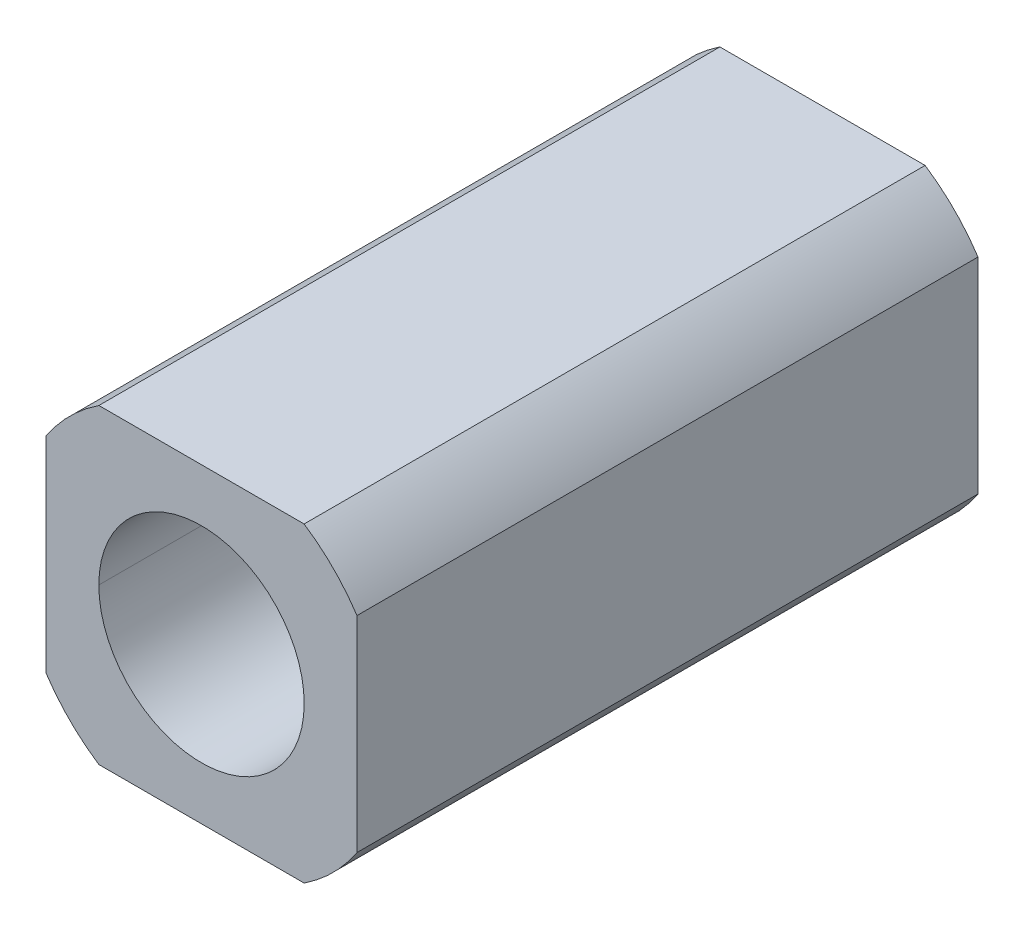
ISO-10303-21;
HEADER;
FILE_DESCRIPTION(('STEP AP214'),'2;1');
FILE_NAME('part.step','',(''),(''),'','','');
FILE_SCHEMA(('AUTOMOTIVE_DESIGN { 1 0 10303 214 1 1 1 1 }'));
ENDSEC;
DATA;
#1=APPLICATION_CONTEXT('core data for automotive mechanical design processes');
#2=APPLICATION_PROTOCOL_DEFINITION('international standard','automotive_design',2000,#1);
#3=PRODUCT_CONTEXT('',#1,'mechanical');
#4=PRODUCT('Part','Part','',(#3));
#5=PRODUCT_RELATED_PRODUCT_CATEGORY('part','',(#4));
#6=PRODUCT_DEFINITION_FORMATION('','',#4);
#7=PRODUCT_DEFINITION_CONTEXT('part definition',#1,'design');
#8=PRODUCT_DEFINITION('design','',#6,#7);
#9=PRODUCT_DEFINITION_SHAPE('','',#8);
#10=(LENGTH_UNIT() NAMED_UNIT(*) SI_UNIT(.MILLI.,.METRE.));
#11=(NAMED_UNIT(*) PLANE_ANGLE_UNIT() SI_UNIT($,.RADIAN.));
#12=(NAMED_UNIT(*) SI_UNIT($,.STERADIAN.) SOLID_ANGLE_UNIT());
#13=UNCERTAINTY_MEASURE_WITH_UNIT(LENGTH_MEASURE(1.E-05),#10,'distance_accuracy_value','');
#14=(GEOMETRIC_REPRESENTATION_CONTEXT(3) GLOBAL_UNCERTAINTY_ASSIGNED_CONTEXT((#13)) GLOBAL_UNIT_ASSIGNED_CONTEXT((#10,
#11,#12)) REPRESENTATION_CONTEXT('',''));
#15=CARTESIAN_POINT('',(0.,0.,0.));
#16=DIRECTION('',(0.,0.,1.));
#17=DIRECTION('',(1.,0.,0.));
#18=AXIS2_PLACEMENT_3D('',#15,#16,#17);
#19=CARTESIAN_POINT('',(0.,0.,6.35));
#20=DIRECTION('',(0.,0.,-1.));
#21=DIRECTION('',(-1.,0.,0.));
#22=AXIS2_PLACEMENT_3D('',#19,#20,#21);
#23=CYLINDRICAL_SURFACE('',#22,2.1);
#24=DIRECTION('',(0.,0.,-1.));
#25=VECTOR('',#24,1.);
#26=CARTESIAN_POINT('',(2.1,0.,6.35));
#27=LINE('',#26,#25);
#28=CARTESIAN_POINT('',(2.1,0.,6.35));
#29=VERTEX_POINT('',#28);
#30=CARTESIAN_POINT('',(2.1,0.,-6.35));
#31=VERTEX_POINT('',#30);
#32=EDGE_CURVE('E153',#29,#31,#27,.T.);
#33=ORIENTED_EDGE('',*,*,#32,.F.);
#34=CARTESIAN_POINT('',(0.,0.,6.35));
#35=DIRECTION('',(0.,0.,1.));
#36=DIRECTION('',(1.,0.,0.));
#37=AXIS2_PLACEMENT_3D('',#34,#35,#36);
#38=CIRCLE('',#37,2.1);
#39=CARTESIAN_POINT('',(-2.1,0.,6.35));
#40=VERTEX_POINT('',#39);
#41=EDGE_CURVE('E231',#29,#40,#38,.T.);
#42=ORIENTED_EDGE('',*,*,#41,.T.);
#43=DIRECTION('',(0.,0.,-1.));
#44=VECTOR('',#43,1.);
#45=CARTESIAN_POINT('',(-2.1,0.,6.35));
#46=LINE('',#45,#44);
#47=CARTESIAN_POINT('',(-2.1,0.,-6.35));
#48=VERTEX_POINT('',#47);
#49=EDGE_CURVE('E156',#40,#48,#46,.T.);
#50=ORIENTED_EDGE('',*,*,#49,.T.);
#51=CARTESIAN_POINT('',(0.,0.,-6.35));
#52=DIRECTION('',(0.,0.,1.));
#53=DIRECTION('',(1.,0.,0.));
#54=AXIS2_PLACEMENT_3D('',#51,#52,#53);
#55=CIRCLE('',#54,2.1);
#56=EDGE_CURVE('E145',#31,#48,#55,.T.);
#57=ORIENTED_EDGE('',*,*,#56,.F.);
#58=EDGE_LOOP('',(#33,#42,#50,#57));
#59=FACE_BOUND('',#58,.T.);
#60=ADVANCED_FACE('F17',(#59),#23,.F.);
#61=CARTESIAN_POINT('',(3.18,-2.09849946390272,6.35));
#62=DIRECTION('',(-1.,0.,0.));
#63=DIRECTION('',(0.,0.,1.));
#64=AXIS2_PLACEMENT_3D('',#61,#62,#63);
#65=PLANE('',#64);
#66=DIRECTION('',(0.,1.,0.));
#67=VECTOR('',#66,1.);
#68=CARTESIAN_POINT('',(3.18,-2.09849946390272,-6.35));
#69=LINE('',#68,#67);
#70=CARTESIAN_POINT('',(3.18,-2.09849946390272,-6.35));
#71=VERTEX_POINT('',#70);
#72=CARTESIAN_POINT('',(3.18,2.09849946390272,-6.35));
#73=VERTEX_POINT('',#72);
#74=EDGE_CURVE('E240',#71,#73,#69,.T.);
#75=ORIENTED_EDGE('',*,*,#74,.T.);
#76=DIRECTION('',(0.,0.,-1.));
#77=VECTOR('',#76,1.);
#78=CARTESIAN_POINT('',(3.18,2.09849946390272,6.35));
#79=LINE('',#78,#77);
#80=CARTESIAN_POINT('',(3.18,2.09849946390272,6.35));
#81=VERTEX_POINT('',#80);
#82=EDGE_CURVE('E135',#81,#73,#79,.T.);
#83=ORIENTED_EDGE('',*,*,#82,.F.);
#84=DIRECTION('',(0.,1.,0.));
#85=VECTOR('',#84,1.);
#86=CARTESIAN_POINT('',(3.18,-2.09849946390272,6.35));
#87=LINE('',#86,#85);
#88=CARTESIAN_POINT('',(3.18,-2.09849946390272,6.35));
#89=VERTEX_POINT('',#88);
#90=EDGE_CURVE('E219',#89,#81,#87,.T.);
#91=ORIENTED_EDGE('',*,*,#90,.F.);
#92=DIRECTION('',(0.,0.,-1.));
#93=VECTOR('',#92,1.);
#94=CARTESIAN_POINT('',(3.18,-2.09849946390272,6.35));
#95=LINE('',#94,#93);
#96=EDGE_CURVE('E11',#89,#71,#95,.T.);
#97=ORIENTED_EDGE('',*,*,#96,.T.);
#98=EDGE_LOOP('',(#75,#83,#91,#97));
#99=FACE_BOUND('',#98,.T.);
#100=ADVANCED_FACE('F286',(#99),#65,.F.);
#101=CARTESIAN_POINT('',(0.,0.,6.35));
#102=DIRECTION('',(0.,0.,-1.));
#103=DIRECTION('',(-1.,0.,0.));
#104=AXIS2_PLACEMENT_3D('',#101,#102,#103);
#105=CYLINDRICAL_SURFACE('',#104,3.81);
#106=CARTESIAN_POINT('',(0.,0.,-6.35));
#107=DIRECTION('',(0.,0.,1.));
#108=DIRECTION('',(1.,0.,0.));
#109=AXIS2_PLACEMENT_3D('',#106,#107,#108);
#110=CIRCLE('',#109,3.81);
#111=CARTESIAN_POINT('',(2.09849946390272,-3.18,-6.35));
#112=VERTEX_POINT('',#111);
#113=EDGE_CURVE('E206',#112,#71,#110,.T.);
#114=ORIENTED_EDGE('',*,*,#113,.T.);
#115=ORIENTED_EDGE('',*,*,#96,.F.);
#116=CARTESIAN_POINT('',(0.,0.,6.35));
#117=DIRECTION('',(0.,0.,1.));
#118=DIRECTION('',(1.,0.,0.));
#119=AXIS2_PLACEMENT_3D('',#116,#117,#118);
#120=CIRCLE('',#119,3.81);
#121=CARTESIAN_POINT('',(2.09849946390272,-3.18,6.35));
#122=VERTEX_POINT('',#121);
#123=EDGE_CURVE('E215',#122,#89,#120,.T.);
#124=ORIENTED_EDGE('',*,*,#123,.F.);
#125=DIRECTION('',(0.,0.,-1.));
#126=VECTOR('',#125,1.);
#127=CARTESIAN_POINT('',(2.09849946390272,-3.18,6.35));
#128=LINE('',#127,#126);
#129=EDGE_CURVE('E28',#122,#112,#128,.T.);
#130=ORIENTED_EDGE('',*,*,#129,.T.);
#131=EDGE_LOOP('',(#114,#115,#124,#130));
#132=FACE_BOUND('',#131,.T.);
#133=ADVANCED_FACE('F291',(#132),#105,.T.);
#134=CARTESIAN_POINT('',(2.09849946390272,-3.18,6.35));
#135=DIRECTION('',(0.,1.,0.));
#136=DIRECTION('',(1.,0.,0.));
#137=AXIS2_PLACEMENT_3D('',#134,#135,#136);
#138=PLANE('',#137);
#139=DIRECTION('',(1.,0.,0.));
#140=VECTOR('',#139,1.);
#141=CARTESIAN_POINT('',(2.09849946390272,-3.18,-6.35));
#142=LINE('',#141,#140);
#143=CARTESIAN_POINT('',(-2.09849946390272,-3.18,-6.35));
#144=VERTEX_POINT('',#143);
#145=EDGE_CURVE('E185',#144,#112,#142,.T.);
#146=ORIENTED_EDGE('',*,*,#145,.T.);
#147=ORIENTED_EDGE('',*,*,#129,.F.);
#148=DIRECTION('',(1.,0.,0.));
#149=VECTOR('',#148,1.);
#150=CARTESIAN_POINT('',(2.09849946390272,-3.18,6.35));
#151=LINE('',#150,#149);
#152=CARTESIAN_POINT('',(-2.09849946390272,-3.18,6.35));
#153=VERTEX_POINT('',#152);
#154=EDGE_CURVE('E220',#153,#122,#151,.T.);
#155=ORIENTED_EDGE('',*,*,#154,.F.);
#156=DIRECTION('',(0.,0.,-1.));
#157=VECTOR('',#156,1.);
#158=CARTESIAN_POINT('',(-2.09849946390272,-3.18,6.35));
#159=LINE('',#158,#157);
#160=EDGE_CURVE('E85',#153,#144,#159,.T.);
#161=ORIENTED_EDGE('',*,*,#160,.T.);
#162=EDGE_LOOP('',(#146,#147,#155,#161));
#163=FACE_BOUND('',#162,.T.);
#164=ADVANCED_FACE('F19',(#163),#138,.F.);
#165=CARTESIAN_POINT('',(0.,0.,6.35));
#166=DIRECTION('',(0.,0.,-1.));
#167=DIRECTION('',(-1.,0.,0.));
#168=AXIS2_PLACEMENT_3D('',#165,#166,#167);
#169=CYLINDRICAL_SURFACE('',#168,3.81);
#170=CARTESIAN_POINT('',(0.,0.,-6.35));
#171=DIRECTION('',(0.,0.,1.));
#172=DIRECTION('',(1.,0.,0.));
#173=AXIS2_PLACEMENT_3D('',#170,#171,#172);
#174=CIRCLE('',#173,3.81);
#175=CARTESIAN_POINT('',(-3.18,-2.09849946390272,-6.35));
#176=VERTEX_POINT('',#175);
#177=EDGE_CURVE('E183',#176,#144,#174,.T.);
#178=ORIENTED_EDGE('',*,*,#177,.T.);
#179=ORIENTED_EDGE('',*,*,#160,.F.);
#180=CARTESIAN_POINT('',(0.,0.,6.35));
#181=DIRECTION('',(0.,0.,1.));
#182=DIRECTION('',(1.,0.,0.));
#183=AXIS2_PLACEMENT_3D('',#180,#181,#182);
#184=CIRCLE('',#183,3.81);
#185=CARTESIAN_POINT('',(-3.18,-2.09849946390272,6.35));
#186=VERTEX_POINT('',#185);
#187=EDGE_CURVE('E224',#186,#153,#184,.T.);
#188=ORIENTED_EDGE('',*,*,#187,.F.);
#189=DIRECTION('',(0.,0.,-1.));
#190=VECTOR('',#189,1.);
#191=CARTESIAN_POINT('',(-3.18,-2.09849946390272,6.35));
#192=LINE('',#191,#190);
#193=EDGE_CURVE('E72',#186,#176,#192,.T.);
#194=ORIENTED_EDGE('',*,*,#193,.T.);
#195=EDGE_LOOP('',(#178,#179,#188,#194));
#196=FACE_BOUND('',#195,.T.);
#197=ADVANCED_FACE('F281',(#196),#169,.T.);
#198=CARTESIAN_POINT('',(-3.18,-2.09849946390272,6.35));
#199=DIRECTION('',(1.,0.,0.));
#200=DIRECTION('',(0.,1.,0.));
#201=AXIS2_PLACEMENT_3D('',#198,#199,#200);
#202=PLANE('',#201);
#203=DIRECTION('',(0.,-1.,0.));
#204=VECTOR('',#203,1.);
#205=CARTESIAN_POINT('',(-3.18,-2.09849946390272,-6.35));
#206=LINE('',#205,#204);
#207=CARTESIAN_POINT('',(-3.18,2.09849946390272,-6.35));
#208=VERTEX_POINT('',#207);
#209=EDGE_CURVE('E184',#208,#176,#206,.T.);
#210=ORIENTED_EDGE('',*,*,#209,.T.);
#211=ORIENTED_EDGE('',*,*,#193,.F.);
#212=DIRECTION('',(0.,-1.,0.));
#213=VECTOR('',#212,1.);
#214=CARTESIAN_POINT('',(-3.18,-2.09849946390272,6.35));
#215=LINE('',#214,#213);
#216=CARTESIAN_POINT('',(-3.18,2.09849946390272,6.35));
#217=VERTEX_POINT('',#216);
#218=EDGE_CURVE('E181',#217,#186,#215,.T.);
#219=ORIENTED_EDGE('',*,*,#218,.F.);
#220=DIRECTION('',(0.,0.,-1.));
#221=VECTOR('',#220,1.);
#222=CARTESIAN_POINT('',(-3.18,2.09849946390272,6.35));
#223=LINE('',#222,#221);
#224=EDGE_CURVE('E95',#217,#208,#223,.T.);
#225=ORIENTED_EDGE('',*,*,#224,.T.);
#226=EDGE_LOOP('',(#210,#211,#219,#225));
#227=FACE_BOUND('',#226,.T.);
#228=ADVANCED_FACE('F272',(#227),#202,.F.);
#229=CARTESIAN_POINT('',(0.,0.,6.35));
#230=DIRECTION('',(0.,0.,-1.));
#231=DIRECTION('',(-1.,0.,0.));
#232=AXIS2_PLACEMENT_3D('',#229,#230,#231);
#233=CYLINDRICAL_SURFACE('',#232,3.81);
#234=CARTESIAN_POINT('',(0.,0.,-6.35));
#235=DIRECTION('',(0.,0.,1.));
#236=DIRECTION('',(1.,0.,0.));
#237=AXIS2_PLACEMENT_3D('',#234,#235,#236);
#238=CIRCLE('',#237,3.81);
#239=CARTESIAN_POINT('',(-2.09849946390272,3.18,-6.35));
#240=VERTEX_POINT('',#239);
#241=EDGE_CURVE('E207',#240,#208,#238,.T.);
#242=ORIENTED_EDGE('',*,*,#241,.T.);
#243=ORIENTED_EDGE('',*,*,#224,.F.);
#244=CARTESIAN_POINT('',(0.,0.,6.35));
#245=DIRECTION('',(0.,0.,1.));
#246=DIRECTION('',(1.,0.,0.));
#247=AXIS2_PLACEMENT_3D('',#244,#245,#246);
#248=CIRCLE('',#247,3.81);
#249=CARTESIAN_POINT('',(-2.09849946390272,3.18,6.35));
#250=VERTEX_POINT('',#249);
#251=EDGE_CURVE('E246',#250,#217,#248,.T.);
#252=ORIENTED_EDGE('',*,*,#251,.F.);
#253=DIRECTION('',(0.,0.,-1.));
#254=VECTOR('',#253,1.);
#255=CARTESIAN_POINT('',(-2.09849946390272,3.18,6.35));
#256=LINE('',#255,#254);
#257=EDGE_CURVE('E43',#250,#240,#256,.T.);
#258=ORIENTED_EDGE('',*,*,#257,.T.);
#259=EDGE_LOOP('',(#242,#243,#252,#258));
#260=FACE_BOUND('',#259,.T.);
#261=ADVANCED_FACE('F270',(#260),#233,.T.);
#262=CARTESIAN_POINT('',(2.09849946390272,3.18,6.35));
#263=DIRECTION('',(0.,-1.,0.));
#264=DIRECTION('',(0.,0.,-1.));
#265=AXIS2_PLACEMENT_3D('',#262,#263,#264);
#266=PLANE('',#265);
#267=DIRECTION('',(-1.,0.,0.));
#268=VECTOR('',#267,1.);
#269=CARTESIAN_POINT('',(2.09849946390272,3.18,-6.35));
#270=LINE('',#269,#268);
#271=CARTESIAN_POINT('',(2.09849946390272,3.18,-6.35));
#272=VERTEX_POINT('',#271);
#273=EDGE_CURVE('E160',#272,#240,#270,.T.);
#274=ORIENTED_EDGE('',*,*,#273,.T.);
#275=ORIENTED_EDGE('',*,*,#257,.F.);
#276=DIRECTION('',(-1.,0.,0.));
#277=VECTOR('',#276,1.);
#278=CARTESIAN_POINT('',(2.09849946390272,3.18,6.35));
#279=LINE('',#278,#277);
#280=CARTESIAN_POINT('',(2.09849946390272,3.18,6.35));
#281=VERTEX_POINT('',#280);
#282=EDGE_CURVE('E228',#281,#250,#279,.T.);
#283=ORIENTED_EDGE('',*,*,#282,.F.);
#284=DIRECTION('',(0.,0.,-1.));
#285=VECTOR('',#284,1.);
#286=CARTESIAN_POINT('',(2.09849946390272,3.18,6.35));
#287=LINE('',#286,#285);
#288=EDGE_CURVE('E159',#281,#272,#287,.T.);
#289=ORIENTED_EDGE('',*,*,#288,.T.);
#290=EDGE_LOOP('',(#274,#275,#283,#289));
#291=FACE_BOUND('',#290,.T.);
#292=ADVANCED_FACE('F267',(#291),#266,.F.);
#293=CARTESIAN_POINT('',(0.,0.,6.35));
#294=DIRECTION('',(0.,0.,-1.));
#295=DIRECTION('',(-1.,0.,0.));
#296=AXIS2_PLACEMENT_3D('',#293,#294,#295);
#297=CYLINDRICAL_SURFACE('',#296,3.81);
#298=CARTESIAN_POINT('',(0.,0.,-6.35));
#299=DIRECTION('',(0.,0.,1.));
#300=DIRECTION('',(1.,0.,0.));
#301=AXIS2_PLACEMENT_3D('',#298,#299,#300);
#302=CIRCLE('',#301,3.81);
#303=EDGE_CURVE('E21',#73,#272,#302,.T.);
#304=ORIENTED_EDGE('',*,*,#303,.T.);
#305=ORIENTED_EDGE('',*,*,#288,.F.);
#306=CARTESIAN_POINT('',(0.,0.,6.35));
#307=DIRECTION('',(0.,0.,1.));
#308=DIRECTION('',(1.,0.,0.));
#309=AXIS2_PLACEMENT_3D('',#306,#307,#308);
#310=CIRCLE('',#309,3.81);
#311=EDGE_CURVE('E214',#81,#281,#310,.T.);
#312=ORIENTED_EDGE('',*,*,#311,.F.);
#313=ORIENTED_EDGE('',*,*,#82,.T.);
#314=EDGE_LOOP('',(#304,#305,#312,#313));
#315=FACE_BOUND('',#314,.T.);
#316=ADVANCED_FACE('F279',(#315),#297,.T.);
#317=CARTESIAN_POINT('',(0.,0.,-6.35));
#318=DIRECTION('',(0.,0.,1.));
#319=DIRECTION('',(1.,0.,0.));
#320=AXIS2_PLACEMENT_3D('',#317,#318,#319);
#321=PLANE('',#320);
#322=CARTESIAN_POINT('',(0.,0.,-6.35));
#323=DIRECTION('',(0.,0.,1.));
#324=DIRECTION('',(1.,0.,0.));
#325=AXIS2_PLACEMENT_3D('',#322,#323,#324);
#326=CIRCLE('',#325,2.1);
#327=EDGE_CURVE('E162',#48,#31,#326,.T.);
#328=ORIENTED_EDGE('',*,*,#327,.T.);
#329=ORIENTED_EDGE('',*,*,#56,.T.);
#330=EDGE_LOOP('',(#328,#329));
#331=FACE_BOUND('',#330,.T.);
#332=ORIENTED_EDGE('',*,*,#303,.F.);
#333=ORIENTED_EDGE('',*,*,#74,.F.);
#334=ORIENTED_EDGE('',*,*,#113,.F.);
#335=ORIENTED_EDGE('',*,*,#145,.F.);
#336=ORIENTED_EDGE('',*,*,#177,.F.);
#337=ORIENTED_EDGE('',*,*,#209,.F.);
#338=ORIENTED_EDGE('',*,*,#241,.F.);
#339=ORIENTED_EDGE('',*,*,#273,.F.);
#340=EDGE_LOOP('',(#332,#333,#334,#335,#336,#337,#338,#339));
#341=FACE_BOUND('',#340,.T.);
#342=ADVANCED_FACE('F163',(#331,#341),#321,.F.);
#343=CARTESIAN_POINT('',(0.,0.,6.35));
#344=DIRECTION('',(0.,0.,1.));
#345=DIRECTION('',(1.,0.,0.));
#346=AXIS2_PLACEMENT_3D('',#343,#344,#345);
#347=PLANE('',#346);
#348=CARTESIAN_POINT('',(0.,0.,6.35));
#349=DIRECTION('',(0.,0.,1.));
#350=DIRECTION('',(1.,0.,0.));
#351=AXIS2_PLACEMENT_3D('',#348,#349,#350);
#352=CIRCLE('',#351,2.1);
#353=EDGE_CURVE('E170',#40,#29,#352,.T.);
#354=ORIENTED_EDGE('',*,*,#353,.F.);
#355=ORIENTED_EDGE('',*,*,#41,.F.);
#356=EDGE_LOOP('',(#354,#355));
#357=FACE_BOUND('',#356,.T.);
#358=ORIENTED_EDGE('',*,*,#311,.T.);
#359=ORIENTED_EDGE('',*,*,#282,.T.);
#360=ORIENTED_EDGE('',*,*,#251,.T.);
#361=ORIENTED_EDGE('',*,*,#218,.T.);
#362=ORIENTED_EDGE('',*,*,#187,.T.);
#363=ORIENTED_EDGE('',*,*,#154,.T.);
#364=ORIENTED_EDGE('',*,*,#123,.T.);
#365=ORIENTED_EDGE('',*,*,#90,.T.);
#366=EDGE_LOOP('',(#358,#359,#360,#361,#362,#363,#364,#365));
#367=FACE_BOUND('',#366,.T.);
#368=ADVANCED_FACE('F298',(#357,#367),#347,.T.);
#369=CARTESIAN_POINT('',(0.,0.,6.35));
#370=DIRECTION('',(0.,0.,-1.));
#371=DIRECTION('',(-1.,0.,0.));
#372=AXIS2_PLACEMENT_3D('',#369,#370,#371);
#373=CYLINDRICAL_SURFACE('',#372,2.1);
#374=ORIENTED_EDGE('',*,*,#353,.T.);
#375=ORIENTED_EDGE('',*,*,#32,.T.);
#376=ORIENTED_EDGE('',*,*,#327,.F.);
#377=ORIENTED_EDGE('',*,*,#49,.F.);
#378=EDGE_LOOP('',(#374,#375,#376,#377));
#379=FACE_BOUND('',#378,.T.);
#380=ADVANCED_FACE('F168',(#379),#373,.F.);
#381=CLOSED_SHELL('',(#60,#100,#133,#164,#197,#228,#261,#292,#316,#342,#368,#380));
#382=MANIFOLD_SOLID_BREP('B1',#381);
#383=ADVANCED_BREP_SHAPE_REPRESENTATION('',(#18,#382),#14);
#384=SHAPE_DEFINITION_REPRESENTATION(#9,#383);
ENDSEC;
END-ISO-10303-21;
